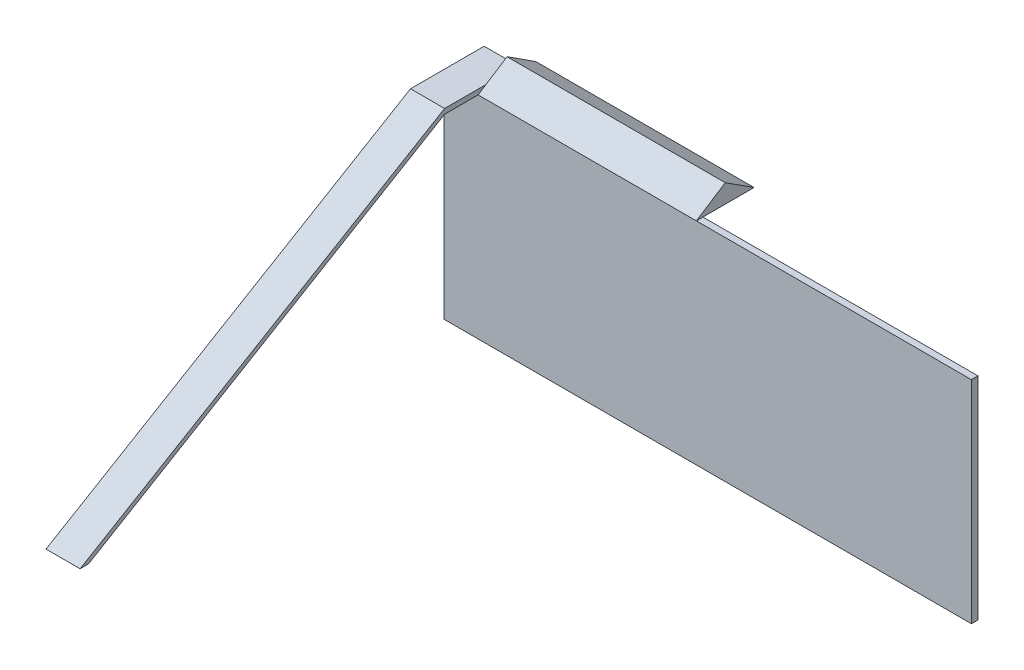
ISO-10303-21;
HEADER;
FILE_DESCRIPTION(('STEP AP214'),'2;1');
FILE_NAME('part.step','',(''),(''),'','','');
FILE_SCHEMA(('AUTOMOTIVE_DESIGN { 1 0 10303 214 1 1 1 1 }'));
ENDSEC;
DATA;
#1=APPLICATION_CONTEXT('core data for automotive mechanical design processes');
#2=APPLICATION_PROTOCOL_DEFINITION('international standard','automotive_design',2000,#1);
#3=PRODUCT_CONTEXT('',#1,'mechanical');
#4=PRODUCT('Part','Part','',(#3));
#5=PRODUCT_RELATED_PRODUCT_CATEGORY('part','',(#4));
#6=PRODUCT_DEFINITION_FORMATION('','',#4);
#7=PRODUCT_DEFINITION_CONTEXT('part definition',#1,'design');
#8=PRODUCT_DEFINITION('design','',#6,#7);
#9=PRODUCT_DEFINITION_SHAPE('','',#8);
#10=(LENGTH_UNIT() NAMED_UNIT(*) SI_UNIT(.MILLI.,.METRE.));
#11=(NAMED_UNIT(*) PLANE_ANGLE_UNIT() SI_UNIT($,.RADIAN.));
#12=(NAMED_UNIT(*) SI_UNIT($,.STERADIAN.) SOLID_ANGLE_UNIT());
#13=UNCERTAINTY_MEASURE_WITH_UNIT(LENGTH_MEASURE(1.E-05),#10,'distance_accuracy_value','');
#14=(GEOMETRIC_REPRESENTATION_CONTEXT(3) GLOBAL_UNCERTAINTY_ASSIGNED_CONTEXT((#13)) GLOBAL_UNIT_ASSIGNED_CONTEXT((#10,
#11,#12)) REPRESENTATION_CONTEXT('',''));
#15=CARTESIAN_POINT('',(0.,0.,0.));
#16=DIRECTION('',(0.,0.,1.));
#17=DIRECTION('',(1.,0.,0.));
#18=AXIS2_PLACEMENT_3D('',#15,#16,#17);
#19=CARTESIAN_POINT('',(0.,930.,-29.));
#20=DIRECTION('',(0.,-1.,0.));
#21=DIRECTION('',(0.,0.,-1.));
#22=AXIS2_PLACEMENT_3D('',#19,#20,#21);
#23=PLANE('',#22);
#24=DIRECTION('',(0.,0.,-1.));
#25=VECTOR('',#24,1.);
#26=CARTESIAN_POINT('',(960.,930.,0.));
#27=LINE('',#26,#25);
#28=CARTESIAN_POINT('',(960.,930.,0.));
#29=VERTEX_POINT('',#28);
#30=CARTESIAN_POINT('',(960.,930.,-29.));
#31=VERTEX_POINT('',#30);
#32=EDGE_CURVE('E57',#29,#31,#27,.T.);
#33=ORIENTED_EDGE('',*,*,#32,.F.);
#34=DIRECTION('',(1.,0.,0.));
#35=VECTOR('',#34,1.);
#36=CARTESIAN_POINT('',(0.,930.,0.));
#37=LINE('',#36,#35);
#38=CARTESIAN_POINT('',(2170.,930.,0.));
#39=VERTEX_POINT('',#38);
#40=EDGE_CURVE('E238',#29,#39,#37,.T.);
#41=ORIENTED_EDGE('',*,*,#40,.T.);
#42=DIRECTION('',(0.,0.,1.));
#43=VECTOR('',#42,1.);
#44=CARTESIAN_POINT('',(2170.,930.,-29.));
#45=LINE('',#44,#43);
#46=CARTESIAN_POINT('',(2170.,930.,-29.));
#47=VERTEX_POINT('',#46);
#48=EDGE_CURVE('E246',#47,#39,#45,.T.);
#49=ORIENTED_EDGE('',*,*,#48,.F.);
#50=DIRECTION('',(1.,0.,0.));
#51=VECTOR('',#50,1.);
#52=CARTESIAN_POINT('',(0.,930.,-29.));
#53=LINE('',#52,#51);
#54=EDGE_CURVE('E227',#31,#47,#53,.T.);
#55=ORIENTED_EDGE('',*,*,#54,.F.);
#56=EDGE_LOOP('',(#33,#41,#49,#55));
#57=FACE_BOUND('',#56,.T.);
#58=ADVANCED_FACE('F35',(#57),#23,.F.);
#59=CARTESIAN_POINT('',(-2.77555756156289E-13,0.,0.));
#60=DIRECTION('',(-1.,0.,0.));
#61=DIRECTION('',(0.,-1.,0.));
#62=AXIS2_PLACEMENT_3D('',#59,#60,#61);
#63=PLANE('',#62);
#64=DIRECTION('',(0.,-0.542428178549572,0.840102178973126));
#65=VECTOR('',#64,1.);
#66=CARTESIAN_POINT('',(0.,656.367654137317,423.796438104405));
#67=LINE('',#66,#65);
#68=CARTESIAN_POINT('',(0.,952.096276874052,-34.2222824756659));
#69=VERTEX_POINT('',#68);
#70=CARTESIAN_POINT('',(0.,929.999999999987,0.));
#71=VERTEX_POINT('',#70);
#72=EDGE_CURVE('E11',#69,#71,#67,.T.);
#73=ORIENTED_EDGE('',*,*,#72,.F.);
#74=DIRECTION('',(0.,0.,-1.));
#75=VECTOR('',#74,1.);
#76=CARTESIAN_POINT('',(0.,952.096276874052,0.));
#77=LINE('',#76,#75);
#78=CARTESIAN_POINT('',(0.,952.096276874052,147.5));
#79=VERTEX_POINT('',#78);
#80=EDGE_CURVE('E186',#79,#69,#77,.T.);
#81=ORIENTED_EDGE('',*,*,#80,.F.);
#82=DIRECTION('',(0.,0.510507387063835,-0.859873367277564));
#83=VECTOR('',#82,1.);
#84=CARTESIAN_POINT('',(0.,768.711373814153,456.384451229827));
#85=LINE('',#84,#83);
#86=CARTESIAN_POINT('',(-2.77555756156289E-13,0.,1751.16382997266));
#87=VERTEX_POINT('',#86);
#88=EDGE_CURVE('E182',#87,#79,#85,.T.);
#89=ORIENTED_EDGE('',*,*,#88,.F.);
#90=DIRECTION('',(0.,0.,1.));
#91=VECTOR('',#90,1.);
#92=CARTESIAN_POINT('',(-2.77555756156289E-13,0.,0.));
#93=LINE('',#92,#91);
#94=CARTESIAN_POINT('',(-2.77555756156289E-13,0.,1713.94595520441));
#95=VERTEX_POINT('',#94);
#96=EDGE_CURVE('E179',#95,#87,#93,.T.);
#97=ORIENTED_EDGE('',*,*,#96,.F.);
#98=DIRECTION('',(0.,-0.510507387063837,0.859873367277563));
#99=VECTOR('',#98,1.);
#100=CARTESIAN_POINT('',(0.,752.373779835877,446.684810875615));
#101=LINE('',#100,#99);
#102=CARTESIAN_POINT('',(0.,929.999999999987,147.5));
#103=VERTEX_POINT('',#102);
#104=EDGE_CURVE('E176',#103,#95,#101,.T.);
#105=ORIENTED_EDGE('',*,*,#104,.F.);
#106=DIRECTION('',(0.,0.,-1.));
#107=VECTOR('',#106,1.);
#108=CARTESIAN_POINT('',(0.,929.999999999987,0.));
#109=LINE('',#108,#107);
#110=EDGE_CURVE('E172',#103,#71,#109,.T.);
#111=ORIENTED_EDGE('',*,*,#110,.T.);
#112=EDGE_LOOP('',(#73,#81,#89,#97,#105,#111));
#113=FACE_BOUND('',#112,.T.);
#114=ADVANCED_FACE('F304',(#113),#63,.F.);
#115=CARTESIAN_POINT('',(0.,0.,-29.));
#116=DIRECTION('',(0.,-1.,0.));
#117=DIRECTION('',(0.,0.,-1.));
#118=AXIS2_PLACEMENT_3D('',#115,#116,#117);
#119=PLANE('',#118);
#120=DIRECTION('',(1.,0.,0.));
#121=VECTOR('',#120,1.);
#122=CARTESIAN_POINT('',(0.,0.,0.));
#123=LINE('',#122,#121);
#124=CARTESIAN_POINT('',(-150.,0.,0.));
#125=VERTEX_POINT('',#124);
#126=CARTESIAN_POINT('',(2170.,0.,0.));
#127=VERTEX_POINT('',#126);
#128=EDGE_CURVE('E209',#125,#127,#123,.T.);
#129=ORIENTED_EDGE('',*,*,#128,.F.);
#130=DIRECTION('',(0.,0.,1.));
#131=VECTOR('',#130,1.);
#132=CARTESIAN_POINT('',(-150.,0.,-29.));
#133=LINE('',#132,#131);
#134=CARTESIAN_POINT('',(-150.,0.,-29.));
#135=VERTEX_POINT('',#134);
#136=EDGE_CURVE('E43',#135,#125,#133,.T.);
#137=ORIENTED_EDGE('',*,*,#136,.F.);
#138=DIRECTION('',(1.,0.,0.));
#139=VECTOR('',#138,1.);
#140=CARTESIAN_POINT('',(0.,0.,-29.));
#141=LINE('',#140,#139);
#142=CARTESIAN_POINT('',(2170.,0.,-29.));
#143=VERTEX_POINT('',#142);
#144=EDGE_CURVE('E220',#135,#143,#141,.T.);
#145=ORIENTED_EDGE('',*,*,#144,.T.);
#146=DIRECTION('',(0.,0.,1.));
#147=VECTOR('',#146,1.);
#148=CARTESIAN_POINT('',(2170.,0.,-29.));
#149=LINE('',#148,#147);
#150=EDGE_CURVE('E232',#143,#127,#149,.T.);
#151=ORIENTED_EDGE('',*,*,#150,.T.);
#152=EDGE_LOOP('',(#129,#137,#145,#151));
#153=FACE_BOUND('',#152,.T.);
#154=ADVANCED_FACE('F37',(#153),#119,.T.);
#155=CARTESIAN_POINT('',(-150.,0.,-29.));
#156=DIRECTION('',(-1.,0.,0.));
#157=DIRECTION('',(0.,-1.,0.));
#158=AXIS2_PLACEMENT_3D('',#155,#156,#157);
#159=PLANE('',#158);
#160=DIRECTION('',(0.,-1.,0.));
#161=VECTOR('',#160,1.);
#162=CARTESIAN_POINT('',(-150.,0.,0.));
#163=LINE('',#162,#161);
#164=CARTESIAN_POINT('',(-150.,930.,0.));
#165=VERTEX_POINT('',#164);
#166=EDGE_CURVE('E224',#165,#125,#163,.T.);
#167=ORIENTED_EDGE('',*,*,#166,.F.);
#168=DIRECTION('',(0.,0.,-1.));
#169=VECTOR('',#168,1.);
#170=CARTESIAN_POINT('',(-150.,929.999999999987,0.));
#171=LINE('',#170,#169);
#172=CARTESIAN_POINT('',(-150.,929.999999999987,147.5));
#173=VERTEX_POINT('',#172);
#174=EDGE_CURVE('E193',#173,#165,#171,.T.);
#175=ORIENTED_EDGE('',*,*,#174,.F.);
#176=DIRECTION('',(0.,-0.510507387063837,0.859873367277563));
#177=VECTOR('',#176,1.);
#178=CARTESIAN_POINT('',(-150.,752.373779835877,446.684810875615));
#179=LINE('',#178,#177);
#180=CARTESIAN_POINT('',(-150.,1.11022302462516E-13,1713.94595520441));
#181=VERTEX_POINT('',#180);
#182=EDGE_CURVE('E196',#173,#181,#179,.T.);
#183=ORIENTED_EDGE('',*,*,#182,.T.);
#184=DIRECTION('',(0.,0.,1.));
#185=VECTOR('',#184,1.);
#186=CARTESIAN_POINT('',(-150.,0.,0.));
#187=LINE('',#186,#185);
#188=CARTESIAN_POINT('',(-150.,0.,1751.16382997266));
#189=VERTEX_POINT('',#188);
#190=EDGE_CURVE('E199',#181,#189,#187,.T.);
#191=ORIENTED_EDGE('',*,*,#190,.T.);
#192=DIRECTION('',(0.,0.510507387063835,-0.859873367277564));
#193=VECTOR('',#192,1.);
#194=CARTESIAN_POINT('',(-150.,768.711373814153,456.384451229827));
#195=LINE('',#194,#193);
#196=CARTESIAN_POINT('',(-150.,952.096276874052,147.5));
#197=VERTEX_POINT('',#196);
#198=EDGE_CURVE('E202',#189,#197,#195,.T.);
#199=ORIENTED_EDGE('',*,*,#198,.T.);
#200=DIRECTION('',(0.,0.,-1.));
#201=VECTOR('',#200,1.);
#202=CARTESIAN_POINT('',(-150.,952.096276874052,0.));
#203=LINE('',#202,#201);
#204=CARTESIAN_POINT('',(-150.,952.096276874052,-176.5));
#205=VERTEX_POINT('',#204);
#206=EDGE_CURVE('E173',#197,#205,#203,.T.);
#207=ORIENTED_EDGE('',*,*,#206,.T.);
#208=DIRECTION('',(0.,1.,0.));
#209=VECTOR('',#208,1.);
#210=CARTESIAN_POINT('',(-150.,2.76471957726662E-13,-176.500000000001));
#211=LINE('',#210,#209);
#212=CARTESIAN_POINT('',(-150.,929.999999999987,-176.5));
#213=VERTEX_POINT('',#212);
#214=EDGE_CURVE('E153',#213,#205,#211,.T.);
#215=ORIENTED_EDGE('',*,*,#214,.F.);
#216=CARTESIAN_POINT('',(-150.,930.,-29.));
#217=VERTEX_POINT('',#216);
#218=EDGE_CURVE('E192',#217,#213,#171,.T.);
#219=ORIENTED_EDGE('',*,*,#218,.F.);
#220=DIRECTION('',(0.,-1.,0.));
#221=VECTOR('',#220,1.);
#222=CARTESIAN_POINT('',(-150.,0.,-29.));
#223=LINE('',#222,#221);
#224=EDGE_CURVE('E229',#217,#135,#223,.T.);
#225=ORIENTED_EDGE('',*,*,#224,.T.);
#226=ORIENTED_EDGE('',*,*,#136,.T.);
#227=EDGE_LOOP('',(#167,#175,#183,#191,#199,#207,#215,#219,#225,#226));
#228=FACE_BOUND('',#227,.T.);
#229=ADVANCED_FACE('F261',(#228),#159,.T.);
#230=CARTESIAN_POINT('',(2170.,0.,-29.));
#231=DIRECTION('',(1.,0.,0.));
#232=DIRECTION('',(0.,0.,-1.));
#233=AXIS2_PLACEMENT_3D('',#230,#231,#232);
#234=PLANE('',#233);
#235=DIRECTION('',(0.,1.,0.));
#236=VECTOR('',#235,1.);
#237=CARTESIAN_POINT('',(2170.,0.,0.));
#238=LINE('',#237,#236);
#239=EDGE_CURVE('E235',#127,#39,#238,.T.);
#240=ORIENTED_EDGE('',*,*,#239,.F.);
#241=ORIENTED_EDGE('',*,*,#150,.F.);
#242=DIRECTION('',(0.,1.,0.));
#243=VECTOR('',#242,1.);
#244=CARTESIAN_POINT('',(2170.,0.,-29.));
#245=LINE('',#244,#243);
#246=EDGE_CURVE('E223',#143,#47,#245,.T.);
#247=ORIENTED_EDGE('',*,*,#246,.T.);
#248=ORIENTED_EDGE('',*,*,#48,.T.);
#249=EDGE_LOOP('',(#240,#241,#247,#248));
#250=FACE_BOUND('',#249,.T.);
#251=ADVANCED_FACE('F254',(#250),#234,.T.);
#252=CARTESIAN_POINT('',(0.,0.,-29.));
#253=DIRECTION('',(0.,0.,1.));
#254=DIRECTION('',(1.,0.,0.));
#255=AXIS2_PLACEMENT_3D('',#252,#253,#254);
#256=PLANE('',#255);
#257=ORIENTED_EDGE('',*,*,#144,.F.);
#258=ORIENTED_EDGE('',*,*,#224,.F.);
#259=EDGE_CURVE('E50',#217,#31,#53,.T.);
#260=ORIENTED_EDGE('',*,*,#259,.T.);
#261=ORIENTED_EDGE('',*,*,#54,.T.);
#262=ORIENTED_EDGE('',*,*,#246,.F.);
#263=EDGE_LOOP('',(#257,#258,#260,#261,#262));
#264=FACE_BOUND('',#263,.T.);
#265=ADVANCED_FACE('F293',(#264),#256,.F.);
#266=CARTESIAN_POINT('',(0.,0.,0.));
#267=DIRECTION('',(0.,0.,1.));
#268=DIRECTION('',(1.,0.,0.));
#269=AXIS2_PLACEMENT_3D('',#266,#267,#268);
#270=PLANE('',#269);
#271=ORIENTED_EDGE('',*,*,#128,.T.);
#272=ORIENTED_EDGE('',*,*,#239,.T.);
#273=ORIENTED_EDGE('',*,*,#40,.F.);
#274=EDGE_CURVE('E242',#71,#29,#37,.T.);
#275=ORIENTED_EDGE('',*,*,#274,.F.);
#276=EDGE_CURVE('E239',#165,#71,#37,.T.);
#277=ORIENTED_EDGE('',*,*,#276,.F.);
#278=ORIENTED_EDGE('',*,*,#166,.T.);
#279=EDGE_LOOP('',(#271,#272,#273,#275,#277,#278));
#280=FACE_BOUND('',#279,.T.);
#281=ADVANCED_FACE('F257',(#280),#270,.T.);
#282=CARTESIAN_POINT('',(0.,929.999999999987,0.));
#283=DIRECTION('',(0.,1.,0.));
#284=DIRECTION('',(-1.,0.,0.));
#285=AXIS2_PLACEMENT_3D('',#282,#283,#284);
#286=PLANE('',#285);
#287=DIRECTION('',(-1.,0.,0.));
#288=VECTOR('',#287,1.);
#289=CARTESIAN_POINT('',(0.,929.999999999987,-176.5));
#290=LINE('',#289,#288);
#291=CARTESIAN_POINT('',(3.34538878514607E-13,930.,-176.5));
#292=VERTEX_POINT('',#291);
#293=EDGE_CURVE('E189',#292,#213,#290,.T.);
#294=ORIENTED_EDGE('',*,*,#293,.F.);
#295=DIRECTION('',(0.,0.,-1.));
#296=VECTOR('',#295,1.);
#297=CARTESIAN_POINT('',(3.34538878514607E-13,930.000000000001,0.));
#298=LINE('',#297,#296);
#299=CARTESIAN_POINT('',(3.34538878514607E-13,930.,-254.));
#300=VERTEX_POINT('',#299);
#301=EDGE_CURVE('E150',#292,#300,#298,.T.);
#302=ORIENTED_EDGE('',*,*,#301,.T.);
#303=DIRECTION('',(-1.,0.,0.));
#304=VECTOR('',#303,1.);
#305=CARTESIAN_POINT('',(960.,930.,-254.));
#306=LINE('',#305,#304);
#307=CARTESIAN_POINT('',(960.,930.,-254.));
#308=VERTEX_POINT('',#307);
#309=EDGE_CURVE('E146',#308,#300,#306,.T.);
#310=ORIENTED_EDGE('',*,*,#309,.F.);
#311=EDGE_CURVE('E135',#31,#308,#27,.T.);
#312=ORIENTED_EDGE('',*,*,#311,.F.);
#313=ORIENTED_EDGE('',*,*,#259,.F.);
#314=ORIENTED_EDGE('',*,*,#218,.T.);
#315=EDGE_LOOP('',(#294,#302,#310,#312,#313,#314));
#316=FACE_BOUND('',#315,.T.);
#317=ADVANCED_FACE('F148',(#316),#286,.F.);
#318=CARTESIAN_POINT('',(-2.77555756156289E-13,2.22751488793186E-13,-176.500000000001));
#319=DIRECTION('',(0.,0.,1.));
#320=DIRECTION('',(0.,-1.,0.));
#321=AXIS2_PLACEMENT_3D('',#318,#319,#320);
#322=PLANE('',#321);
#323=ORIENTED_EDGE('',*,*,#214,.T.);
#324=DIRECTION('',(-1.,0.,0.));
#325=VECTOR('',#324,1.);
#326=CARTESIAN_POINT('',(0.,952.096276874052,-176.5));
#327=LINE('',#326,#325);
#328=CARTESIAN_POINT('',(0.,952.096276874052,-176.5));
#329=VERTEX_POINT('',#328);
#330=EDGE_CURVE('E207',#329,#205,#327,.T.);
#331=ORIENTED_EDGE('',*,*,#330,.F.);
#332=DIRECTION('',(0.,1.,0.));
#333=VECTOR('',#332,1.);
#334=CARTESIAN_POINT('',(-2.77555756156289E-13,2.22751488793186E-13,-176.500000000001));
#335=LINE('',#334,#333);
#336=EDGE_CURVE('E169',#292,#329,#335,.T.);
#337=ORIENTED_EDGE('',*,*,#336,.F.);
#338=ORIENTED_EDGE('',*,*,#293,.T.);
#339=EDGE_LOOP('',(#323,#331,#337,#338));
#340=FACE_BOUND('',#339,.T.);
#341=ADVANCED_FACE('F286',(#340),#322,.F.);
#342=CARTESIAN_POINT('',(0.,952.096276874052,0.));
#343=DIRECTION('',(0.,1.,0.));
#344=DIRECTION('',(-1.,0.,0.));
#345=AXIS2_PLACEMENT_3D('',#342,#343,#344);
#346=PLANE('',#345);
#347=ORIENTED_EDGE('',*,*,#206,.F.);
#348=DIRECTION('',(-1.,0.,0.));
#349=VECTOR('',#348,1.);
#350=CARTESIAN_POINT('',(0.,952.096276874052,147.5));
#351=LINE('',#350,#349);
#352=EDGE_CURVE('E210',#79,#197,#351,.T.);
#353=ORIENTED_EDGE('',*,*,#352,.F.);
#354=ORIENTED_EDGE('',*,*,#80,.T.);
#355=EDGE_CURVE('E185',#69,#329,#77,.T.);
#356=ORIENTED_EDGE('',*,*,#355,.T.);
#357=ORIENTED_EDGE('',*,*,#330,.T.);
#358=EDGE_LOOP('',(#347,#353,#354,#356,#357));
#359=FACE_BOUND('',#358,.T.);
#360=ADVANCED_FACE('F280',(#359),#346,.T.);
#361=CARTESIAN_POINT('',(0.,768.711373814153,456.384451229827));
#362=DIRECTION('',(0.,0.859873367277564,0.510507387063835));
#363=DIRECTION('',(0.,-0.510507387063835,0.859873367277564));
#364=AXIS2_PLACEMENT_3D('',#361,#362,#363);
#365=PLANE('',#364);
#366=ORIENTED_EDGE('',*,*,#198,.F.);
#367=DIRECTION('',(-1.,0.,0.));
#368=VECTOR('',#367,1.);
#369=CARTESIAN_POINT('',(-2.77555756156289E-13,0.,1751.16382997266));
#370=LINE('',#369,#368);
#371=EDGE_CURVE('E212',#87,#189,#370,.T.);
#372=ORIENTED_EDGE('',*,*,#371,.F.);
#373=ORIENTED_EDGE('',*,*,#88,.T.);
#374=ORIENTED_EDGE('',*,*,#352,.T.);
#375=EDGE_LOOP('',(#366,#372,#373,#374));
#376=FACE_BOUND('',#375,.T.);
#377=ADVANCED_FACE('F277',(#376),#365,.T.);
#378=CARTESIAN_POINT('',(-2.77555756156289E-13,0.,0.));
#379=DIRECTION('',(0.,-1.,0.));
#380=DIRECTION('',(1.,0.,0.));
#381=AXIS2_PLACEMENT_3D('',#378,#379,#380);
#382=PLANE('',#381);
#383=ORIENTED_EDGE('',*,*,#190,.F.);
#384=DIRECTION('',(-1.,0.,0.));
#385=VECTOR('',#384,1.);
#386=CARTESIAN_POINT('',(-2.77555756156289E-13,0.,1713.94595520441));
#387=LINE('',#386,#385);
#388=EDGE_CURVE('E214',#95,#181,#387,.T.);
#389=ORIENTED_EDGE('',*,*,#388,.F.);
#390=ORIENTED_EDGE('',*,*,#96,.T.);
#391=ORIENTED_EDGE('',*,*,#371,.T.);
#392=EDGE_LOOP('',(#383,#389,#390,#391));
#393=FACE_BOUND('',#392,.T.);
#394=ADVANCED_FACE('F273',(#393),#382,.T.);
#395=CARTESIAN_POINT('',(0.,752.373779835877,446.684810875615));
#396=DIRECTION('',(0.,-0.859873367277563,-0.510507387063837));
#397=DIRECTION('',(0.,0.510507387063837,-0.859873367277563));
#398=AXIS2_PLACEMENT_3D('',#395,#396,#397);
#399=PLANE('',#398);
#400=ORIENTED_EDGE('',*,*,#182,.F.);
#401=DIRECTION('',(-1.,0.,0.));
#402=VECTOR('',#401,1.);
#403=CARTESIAN_POINT('',(0.,929.999999999987,147.5));
#404=LINE('',#403,#402);
#405=EDGE_CURVE('E216',#103,#173,#404,.T.);
#406=ORIENTED_EDGE('',*,*,#405,.F.);
#407=ORIENTED_EDGE('',*,*,#104,.T.);
#408=ORIENTED_EDGE('',*,*,#388,.T.);
#409=EDGE_LOOP('',(#400,#406,#407,#408));
#410=FACE_BOUND('',#409,.T.);
#411=ADVANCED_FACE('F268',(#410),#399,.T.);
#412=ORIENTED_EDGE('',*,*,#276,.T.);
#413=ORIENTED_EDGE('',*,*,#110,.F.);
#414=ORIENTED_EDGE('',*,*,#405,.T.);
#415=ORIENTED_EDGE('',*,*,#174,.T.);
#416=EDGE_LOOP('',(#412,#413,#414,#415));
#417=FACE_BOUND('',#416,.T.);
#418=ADVANCED_FACE('F264',(#417),#286,.F.);
#419=CARTESIAN_POINT('',(0.,0.,0.));
#420=DIRECTION('',(-1.,0.,0.));
#421=DIRECTION('',(0.,-1.,0.));
#422=AXIS2_PLACEMENT_3D('',#419,#420,#421);
#423=PLANE('',#422);
#424=ORIENTED_EDGE('',*,*,#336,.T.);
#425=ORIENTED_EDGE('',*,*,#355,.F.);
#426=DIRECTION('',(0.,-0.542428178549572,0.840102178973126));
#427=VECTOR('',#426,1.);
#428=CARTESIAN_POINT('',(3.64035854899766E-13,1012.,-127.));
#429=LINE('',#428,#427);
#430=CARTESIAN_POINT('',(3.64035854899766E-13,1012.,-127.));
#431=VERTEX_POINT('',#430);
#432=EDGE_CURVE('E163',#431,#69,#429,.T.);
#433=ORIENTED_EDGE('',*,*,#432,.F.);
#434=DIRECTION('',(0.,0.542428178549575,0.840102178973123));
#435=VECTOR('',#434,1.);
#436=CARTESIAN_POINT('',(3.34538878514607E-13,930.,-254.));
#437=LINE('',#436,#435);
#438=EDGE_CURVE('E167',#300,#431,#437,.T.);
#439=ORIENTED_EDGE('',*,*,#438,.F.);
#440=ORIENTED_EDGE('',*,*,#301,.F.);
#441=EDGE_LOOP('',(#424,#425,#433,#439,#440));
#442=FACE_BOUND('',#441,.T.);
#443=ADVANCED_FACE('F288',(#442),#423,.T.);
#444=CARTESIAN_POINT('',(960.,1012.,-127.));
#445=DIRECTION('',(0.,-0.840102178973126,-0.542428178549572));
#446=DIRECTION('',(0.,0.542428178549572,-0.840102178973126));
#447=AXIS2_PLACEMENT_3D('',#444,#445,#446);
#448=PLANE('',#447);
#449=ORIENTED_EDGE('',*,*,#432,.T.);
#450=ORIENTED_EDGE('',*,*,#72,.T.);
#451=ORIENTED_EDGE('',*,*,#274,.T.);
#452=DIRECTION('',(0.,-0.542428178549572,0.840102178973126));
#453=VECTOR('',#452,1.);
#454=CARTESIAN_POINT('',(960.,1012.,-127.));
#455=LINE('',#454,#453);
#456=CARTESIAN_POINT('',(960.,1012.,-127.));
#457=VERTEX_POINT('',#456);
#458=EDGE_CURVE('E143',#457,#29,#455,.T.);
#459=ORIENTED_EDGE('',*,*,#458,.F.);
#460=DIRECTION('',(-1.,0.,0.));
#461=VECTOR('',#460,1.);
#462=CARTESIAN_POINT('',(960.,1012.,-127.));
#463=LINE('',#462,#461);
#464=EDGE_CURVE('E154',#457,#431,#463,.T.);
#465=ORIENTED_EDGE('',*,*,#464,.T.);
#466=EDGE_LOOP('',(#449,#450,#451,#459,#465));
#467=FACE_BOUND('',#466,.T.);
#468=ADVANCED_FACE('F291',(#467),#448,.F.);
#469=CARTESIAN_POINT('',(960.,930.,-254.));
#470=DIRECTION('',(0.,-0.840102178973123,0.542428178549575));
#471=DIRECTION('',(0.,-0.542428178549575,-0.840102178973123));
#472=AXIS2_PLACEMENT_3D('',#469,#470,#471);
#473=PLANE('',#472);
#474=ORIENTED_EDGE('',*,*,#438,.T.);
#475=ORIENTED_EDGE('',*,*,#464,.F.);
#476=DIRECTION('',(0.,0.542428178549575,0.840102178973123));
#477=VECTOR('',#476,1.);
#478=CARTESIAN_POINT('',(960.,930.,-254.));
#479=LINE('',#478,#477);
#480=EDGE_CURVE('E140',#308,#457,#479,.T.);
#481=ORIENTED_EDGE('',*,*,#480,.F.);
#482=ORIENTED_EDGE('',*,*,#309,.T.);
#483=EDGE_LOOP('',(#474,#475,#481,#482));
#484=FACE_BOUND('',#483,.T.);
#485=ADVANCED_FACE('F156',(#484),#473,.F.);
#486=CARTESIAN_POINT('',(960.,-3.45330455240884E-13,0.));
#487=DIRECTION('',(-1.,0.,0.));
#488=DIRECTION('',(0.,-1.,0.));
#489=AXIS2_PLACEMENT_3D('',#486,#487,#488);
#490=PLANE('',#489);
#491=ORIENTED_EDGE('',*,*,#458,.T.);
#492=ORIENTED_EDGE('',*,*,#32,.T.);
#493=ORIENTED_EDGE('',*,*,#311,.T.);
#494=ORIENTED_EDGE('',*,*,#480,.T.);
#495=EDGE_LOOP('',(#491,#492,#493,#494));
#496=FACE_BOUND('',#495,.T.);
#497=ADVANCED_FACE('F138',(#496),#490,.F.);
#498=CLOSED_SHELL('',(#58,#114,#154,#229,#251,#265,#281,#317,#341,#360,#377,#394,#411,#418,#443,
#468,#485,#497));
#499=MANIFOLD_SOLID_BREP('B2',#498);
#500=ADVANCED_BREP_SHAPE_REPRESENTATION('',(#18,#499),#14);
#501=SHAPE_DEFINITION_REPRESENTATION(#9,#500);
ENDSEC;
END-ISO-10303-21;
